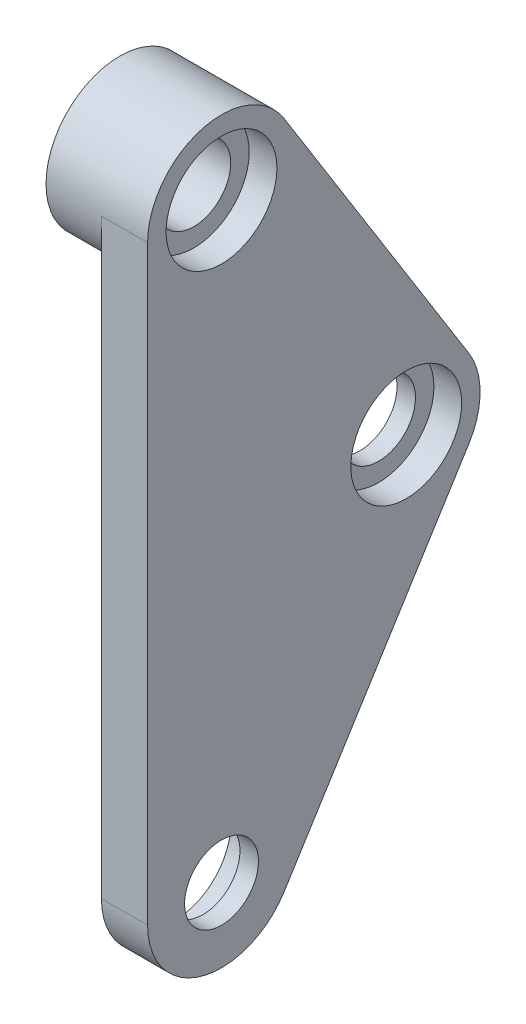
ISO-10303-21;
HEADER;
FILE_DESCRIPTION(('STEP AP214'),'2;1');
FILE_NAME('part.step','',(''),(''),'','','');
FILE_SCHEMA(('AUTOMOTIVE_DESIGN { 1 0 10303 214 1 1 1 1 }'));
ENDSEC;
DATA;
#1=APPLICATION_CONTEXT('core data for automotive mechanical design processes');
#2=APPLICATION_PROTOCOL_DEFINITION('international standard','automotive_design',2000,#1);
#3=PRODUCT_CONTEXT('',#1,'mechanical');
#4=PRODUCT('Part','Part','',(#3));
#5=PRODUCT_RELATED_PRODUCT_CATEGORY('part','',(#4));
#6=PRODUCT_DEFINITION_FORMATION('','',#4);
#7=PRODUCT_DEFINITION_CONTEXT('part definition',#1,'design');
#8=PRODUCT_DEFINITION('design','',#6,#7);
#9=PRODUCT_DEFINITION_SHAPE('','',#8);
#10=(LENGTH_UNIT() NAMED_UNIT(*) SI_UNIT(.MILLI.,.METRE.));
#11=(NAMED_UNIT(*) PLANE_ANGLE_UNIT() SI_UNIT($,.RADIAN.));
#12=(NAMED_UNIT(*) SI_UNIT($,.STERADIAN.) SOLID_ANGLE_UNIT());
#13=UNCERTAINTY_MEASURE_WITH_UNIT(LENGTH_MEASURE(1.E-05),#10,'distance_accuracy_value','');
#14=(GEOMETRIC_REPRESENTATION_CONTEXT(3) GLOBAL_UNCERTAINTY_ASSIGNED_CONTEXT((#13)) GLOBAL_UNIT_ASSIGNED_CONTEXT((#10,
#11,#12)) REPRESENTATION_CONTEXT('',''));
#15=CARTESIAN_POINT('',(0.,0.,0.));
#16=DIRECTION('',(0.,0.,1.));
#17=DIRECTION('',(1.,0.,0.));
#18=AXIS2_PLACEMENT_3D('',#15,#16,#17);
#19=CARTESIAN_POINT('',(2.5,-4.,-4.));
#20=DIRECTION('',(-1.,0.,0.));
#21=DIRECTION('',(0.,0.,1.));
#22=AXIS2_PLACEMENT_3D('',#19,#20,#21);
#23=CYLINDRICAL_SURFACE('',#22,2.);
#24=CARTESIAN_POINT('',(-3.,-4.,-4.));
#25=DIRECTION('',(1.,0.,0.));
#26=DIRECTION('',(0.,0.,-1.));
#27=AXIS2_PLACEMENT_3D('',#24,#25,#26);
#28=CIRCLE('',#27,2.);
#29=CARTESIAN_POINT('',(-3.,-4.,-6.));
#30=VERTEX_POINT('',#29);
#31=EDGE_CURVE('E240',#30,#30,#28,.T.);
#32=ORIENTED_EDGE('',*,*,#31,.F.);
#33=EDGE_LOOP('',(#32));
#34=FACE_BOUND('',#33,.T.);
#35=CARTESIAN_POINT('',(1.,-4.,-4.));
#36=DIRECTION('',(1.,0.,0.));
#37=DIRECTION('',(0.,0.,-1.));
#38=AXIS2_PLACEMENT_3D('',#35,#36,#37);
#39=CIRCLE('',#38,2.);
#40=CARTESIAN_POINT('',(1.,-4.,-6.));
#41=VERTEX_POINT('',#40);
#42=EDGE_CURVE('E243',#41,#41,#39,.F.);
#43=ORIENTED_EDGE('',*,*,#42,.F.);
#44=EDGE_LOOP('',(#43));
#45=FACE_BOUND('',#44,.T.);
#46=ADVANCED_FACE('F127',(#34,#45),#23,.F.);
#47=CARTESIAN_POINT('',(2.5,-20.,-14.));
#48=DIRECTION('',(-1.,0.,0.));
#49=DIRECTION('',(0.,0.,1.));
#50=AXIS2_PLACEMENT_3D('',#47,#48,#49);
#51=CYLINDRICAL_SURFACE('',#50,2.);
#52=CARTESIAN_POINT('',(0.,-20.,-14.));
#53=DIRECTION('',(1.,0.,0.));
#54=DIRECTION('',(0.,0.,-1.));
#55=AXIS2_PLACEMENT_3D('',#52,#53,#54);
#56=CIRCLE('',#55,2.);
#57=CARTESIAN_POINT('',(0.,-20.,-16.));
#58=VERTEX_POINT('',#57);
#59=EDGE_CURVE('E261',#58,#58,#56,.F.);
#60=ORIENTED_EDGE('',*,*,#59,.T.);
#61=EDGE_LOOP('',(#60));
#62=FACE_BOUND('',#61,.T.);
#63=CARTESIAN_POINT('',(1.,-20.,-14.));
#64=DIRECTION('',(1.,0.,0.));
#65=DIRECTION('',(0.,0.,-1.));
#66=AXIS2_PLACEMENT_3D('',#63,#64,#65);
#67=CIRCLE('',#66,2.);
#68=CARTESIAN_POINT('',(1.,-20.,-16.));
#69=VERTEX_POINT('',#68);
#70=EDGE_CURVE('E233',#69,#69,#67,.T.);
#71=ORIENTED_EDGE('',*,*,#70,.T.);
#72=EDGE_LOOP('',(#71));
#73=FACE_BOUND('',#72,.T.);
#74=ADVANCED_FACE('F287',(#62,#73),#51,.F.);
#75=CARTESIAN_POINT('',(2.5,2.79415306338351,-4.47064490141361));
#76=DIRECTION('',(0.,0.52999894000318,-0.847998304005088));
#77=DIRECTION('',(0.,0.847998304005088,0.52999894000318));
#78=AXIS2_PLACEMENT_3D('',#75,#76,#77);
#79=PLANE('',#78);
#80=DIRECTION('',(0.,-0.847998304005088,-0.52999894000318));
#81=VECTOR('',#80,1.);
#82=CARTESIAN_POINT('',(0.,2.79415306338351,-4.47064490141361));
#83=LINE('',#82,#81);
#84=CARTESIAN_POINT('',(0.,-1.88000423998728,-7.39199321602035));
#85=VERTEX_POINT('',#84);
#86=CARTESIAN_POINT('',(0.,-17.8800042399873,-17.3919932160204));
#87=VERTEX_POINT('',#86);
#88=EDGE_CURVE('E215',#85,#87,#83,.T.);
#89=ORIENTED_EDGE('',*,*,#88,.F.);
#90=DIRECTION('',(-1.,0.,0.));
#91=VECTOR('',#90,1.);
#92=CARTESIAN_POINT('',(2.5,-1.88000423998728,-7.39199321602035));
#93=LINE('',#92,#91);
#94=CARTESIAN_POINT('',(2.5,-1.88000423998728,-7.39199321602035));
#95=VERTEX_POINT('',#94);
#96=EDGE_CURVE('E224',#95,#85,#93,.T.);
#97=ORIENTED_EDGE('',*,*,#96,.F.);
#98=DIRECTION('',(0.,-0.847998304005088,-0.52999894000318));
#99=VECTOR('',#98,1.);
#100=CARTESIAN_POINT('',(2.5,2.79415306338351,-4.47064490141361));
#101=LINE('',#100,#99);
#102=CARTESIAN_POINT('',(2.5,-17.8800042399873,-17.3919932160204));
#103=VERTEX_POINT('',#102);
#104=EDGE_CURVE('E208',#95,#103,#101,.T.);
#105=ORIENTED_EDGE('',*,*,#104,.T.);
#106=DIRECTION('',(-1.,0.,0.));
#107=VECTOR('',#106,1.);
#108=CARTESIAN_POINT('',(2.5,-17.8800042399873,-17.3919932160204));
#109=LINE('',#108,#107);
#110=EDGE_CURVE('E137',#103,#87,#109,.T.);
#111=ORIENTED_EDGE('',*,*,#110,.T.);
#112=EDGE_LOOP('',(#89,#97,#105,#111));
#113=FACE_BOUND('',#112,.T.);
#114=ADVANCED_FACE('F293',(#113),#79,.T.);
#115=CARTESIAN_POINT('',(2.5,0.,0.));
#116=DIRECTION('',(0.,0.,-1.));
#117=DIRECTION('',(-1.,0.,0.));
#118=AXIS2_PLACEMENT_3D('',#115,#116,#117);
#119=PLANE('',#118);
#120=DIRECTION('',(0.,-1.,0.));
#121=VECTOR('',#120,1.);
#122=CARTESIAN_POINT('',(0.,0.,0.));
#123=LINE('',#122,#121);
#124=CARTESIAN_POINT('',(0.,-4.,0.));
#125=VERTEX_POINT('',#124);
#126=CARTESIAN_POINT('',(0.,-36.,0.));
#127=VERTEX_POINT('',#126);
#128=EDGE_CURVE('E190',#125,#127,#123,.T.);
#129=ORIENTED_EDGE('',*,*,#128,.T.);
#130=DIRECTION('',(-1.,0.,0.));
#131=VECTOR('',#130,1.);
#132=CARTESIAN_POINT('',(2.5,-36.,0.));
#133=LINE('',#132,#131);
#134=CARTESIAN_POINT('',(2.5,-36.,0.));
#135=VERTEX_POINT('',#134);
#136=EDGE_CURVE('E183',#135,#127,#133,.T.);
#137=ORIENTED_EDGE('',*,*,#136,.F.);
#138=DIRECTION('',(0.,-1.,0.));
#139=VECTOR('',#138,1.);
#140=CARTESIAN_POINT('',(2.5,0.,0.));
#141=LINE('',#140,#139);
#142=CARTESIAN_POINT('',(2.5,-4.,0.));
#143=VERTEX_POINT('',#142);
#144=EDGE_CURVE('E188',#143,#135,#141,.T.);
#145=ORIENTED_EDGE('',*,*,#144,.F.);
#146=DIRECTION('',(-1.,0.,0.));
#147=VECTOR('',#146,1.);
#148=CARTESIAN_POINT('',(2.5,-4.,0.));
#149=LINE('',#148,#147);
#150=EDGE_CURVE('E193',#143,#125,#149,.T.);
#151=ORIENTED_EDGE('',*,*,#150,.T.);
#152=EDGE_LOOP('',(#129,#137,#145,#151));
#153=FACE_BOUND('',#152,.T.);
#154=ADVANCED_FACE('F185',(#153),#119,.F.);
#155=CARTESIAN_POINT('',(2.5,-14.0301081195633,-22.4481729913013));
#156=DIRECTION('',(0.,-0.52999894000318,-0.847998304005088));
#157=DIRECTION('',(0.,0.847998304005088,-0.52999894000318));
#158=AXIS2_PLACEMENT_3D('',#155,#156,#157);
#159=PLANE('',#158);
#160=DIRECTION('',(0.,-0.847998304005088,0.52999894000318));
#161=VECTOR('',#160,1.);
#162=CARTESIAN_POINT('',(0.,-14.0301081195633,-22.4481729913013));
#163=LINE('',#162,#161);
#164=CARTESIAN_POINT('',(0.,-22.1199957600127,-17.3919932160204));
#165=VERTEX_POINT('',#164);
#166=CARTESIAN_POINT('',(0.,-38.1199957600127,-7.39199321602035));
#167=VERTEX_POINT('',#166);
#168=EDGE_CURVE('E212',#165,#167,#163,.T.);
#169=ORIENTED_EDGE('',*,*,#168,.F.);
#170=DIRECTION('',(-1.,0.,0.));
#171=VECTOR('',#170,1.);
#172=CARTESIAN_POINT('',(2.5,-22.1199957600127,-17.3919932160204));
#173=LINE('',#172,#171);
#174=CARTESIAN_POINT('',(2.5,-22.1199957600127,-17.3919932160204));
#175=VERTEX_POINT('',#174);
#176=EDGE_CURVE('E146',#175,#165,#173,.T.);
#177=ORIENTED_EDGE('',*,*,#176,.F.);
#178=DIRECTION('',(0.,-0.847998304005088,0.52999894000318));
#179=VECTOR('',#178,1.);
#180=CARTESIAN_POINT('',(2.5,-14.0301081195633,-22.4481729913013));
#181=LINE('',#180,#179);
#182=CARTESIAN_POINT('',(2.5,-38.1199957600127,-7.39199321602035));
#183=VERTEX_POINT('',#182);
#184=EDGE_CURVE('E207',#175,#183,#181,.T.);
#185=ORIENTED_EDGE('',*,*,#184,.T.);
#186=DIRECTION('',(-1.,0.,0.));
#187=VECTOR('',#186,1.);
#188=CARTESIAN_POINT('',(2.5,-38.1199957600127,-7.39199321602035));
#189=LINE('',#188,#187);
#190=EDGE_CURVE('E163',#183,#167,#189,.T.);
#191=ORIENTED_EDGE('',*,*,#190,.T.);
#192=EDGE_LOOP('',(#169,#177,#185,#191));
#193=FACE_BOUND('',#192,.T.);
#194=ADVANCED_FACE('F338',(#193),#159,.T.);
#195=CARTESIAN_POINT('',(0.,0.,0.));
#196=DIRECTION('',(1.,0.,0.));
#197=DIRECTION('',(0.,0.,-1.));
#198=AXIS2_PLACEMENT_3D('',#195,#196,#197);
#199=PLANE('',#198);
#200=CARTESIAN_POINT('',(0.,-36.,-4.));
#201=DIRECTION('',(1.,0.,0.));
#202=DIRECTION('',(0.,0.,-1.));
#203=AXIS2_PLACEMENT_3D('',#200,#201,#202);
#204=CIRCLE('',#203,3.);
#205=CARTESIAN_POINT('',(0.,-36.,-7.));
#206=VERTEX_POINT('',#205);
#207=EDGE_CURVE('E329',#206,#206,#204,.T.);
#208=ORIENTED_EDGE('',*,*,#207,.T.);
#209=EDGE_LOOP('',(#208));
#210=FACE_BOUND('',#209,.T.);
#211=ORIENTED_EDGE('',*,*,#59,.F.);
#212=EDGE_LOOP('',(#211));
#213=FACE_BOUND('',#212,.T.);
#214=ORIENTED_EDGE('',*,*,#128,.F.);
#215=CARTESIAN_POINT('',(0.,-4.,-4.));
#216=DIRECTION('',(1.,0.,0.));
#217=DIRECTION('',(0.,0.,-1.));
#218=AXIS2_PLACEMENT_3D('',#215,#216,#217);
#219=CIRCLE('',#218,4.);
#220=EDGE_CURVE('E13',#125,#85,#219,.T.);
#221=ORIENTED_EDGE('',*,*,#220,.T.);
#222=ORIENTED_EDGE('',*,*,#88,.T.);
#223=CARTESIAN_POINT('',(0.,-20.,-14.));
#224=DIRECTION('',(1.,0.,0.));
#225=DIRECTION('',(0.,0.,-1.));
#226=AXIS2_PLACEMENT_3D('',#223,#224,#225);
#227=CIRCLE('',#226,4.);
#228=EDGE_CURVE('E199',#165,#87,#227,.T.);
#229=ORIENTED_EDGE('',*,*,#228,.F.);
#230=ORIENTED_EDGE('',*,*,#168,.T.);
#231=CARTESIAN_POINT('',(0.,-36.,-4.));
#232=DIRECTION('',(1.,0.,0.));
#233=DIRECTION('',(0.,0.,-1.));
#234=AXIS2_PLACEMENT_3D('',#231,#232,#233);
#235=CIRCLE('',#234,4.);
#236=EDGE_CURVE('E200',#127,#167,#235,.T.);
#237=ORIENTED_EDGE('',*,*,#236,.F.);
#238=EDGE_LOOP('',(#214,#221,#222,#229,#230,#237));
#239=FACE_BOUND('',#238,.T.);
#240=ADVANCED_FACE('F334',(#210,#213,#239),#199,.F.);
#241=CARTESIAN_POINT('',(2.5,0.,0.));
#242=DIRECTION('',(1.,0.,0.));
#243=DIRECTION('',(0.,0.,-1.));
#244=AXIS2_PLACEMENT_3D('',#241,#242,#243);
#245=PLANE('',#244);
#246=CARTESIAN_POINT('',(2.5,-4.,-4.));
#247=DIRECTION('',(1.,0.,0.));
#248=DIRECTION('',(0.,0.,-1.));
#249=AXIS2_PLACEMENT_3D('',#246,#247,#248);
#250=CIRCLE('',#249,3.);
#251=CARTESIAN_POINT('',(2.5,-4.,-7.));
#252=VERTEX_POINT('',#251);
#253=EDGE_CURVE('E248',#252,#252,#250,.T.);
#254=ORIENTED_EDGE('',*,*,#253,.F.);
#255=EDGE_LOOP('',(#254));
#256=FACE_BOUND('',#255,.T.);
#257=CARTESIAN_POINT('',(2.5,-20.,-14.));
#258=DIRECTION('',(1.,0.,0.));
#259=DIRECTION('',(0.,0.,-1.));
#260=AXIS2_PLACEMENT_3D('',#257,#258,#259);
#261=CIRCLE('',#260,3.);
#262=CARTESIAN_POINT('',(2.5,-20.,-17.));
#263=VERTEX_POINT('',#262);
#264=EDGE_CURVE('E254',#263,#263,#261,.T.);
#265=ORIENTED_EDGE('',*,*,#264,.F.);
#266=EDGE_LOOP('',(#265));
#267=FACE_BOUND('',#266,.T.);
#268=CARTESIAN_POINT('',(2.5,-36.,-4.));
#269=DIRECTION('',(1.,0.,0.));
#270=DIRECTION('',(0.,0.,-1.));
#271=AXIS2_PLACEMENT_3D('',#268,#269,#270);
#272=CIRCLE('',#271,2.);
#273=CARTESIAN_POINT('',(2.5,-36.,-6.));
#274=VERTEX_POINT('',#273);
#275=EDGE_CURVE('E235',#274,#274,#272,.T.);
#276=ORIENTED_EDGE('',*,*,#275,.F.);
#277=EDGE_LOOP('',(#276));
#278=FACE_BOUND('',#277,.T.);
#279=ORIENTED_EDGE('',*,*,#184,.F.);
#280=CARTESIAN_POINT('',(2.5,-20.,-14.));
#281=DIRECTION('',(1.,0.,0.));
#282=DIRECTION('',(0.,0.,-1.));
#283=AXIS2_PLACEMENT_3D('',#280,#281,#282);
#284=CIRCLE('',#283,4.);
#285=EDGE_CURVE('E229',#175,#103,#284,.T.);
#286=ORIENTED_EDGE('',*,*,#285,.T.);
#287=ORIENTED_EDGE('',*,*,#104,.F.);
#288=CARTESIAN_POINT('',(2.5,-4.,-4.));
#289=DIRECTION('',(1.,0.,0.));
#290=DIRECTION('',(0.,0.,-1.));
#291=AXIS2_PLACEMENT_3D('',#288,#289,#290);
#292=CIRCLE('',#291,4.);
#293=EDGE_CURVE('E206',#95,#143,#292,.T.);
#294=ORIENTED_EDGE('',*,*,#293,.T.);
#295=ORIENTED_EDGE('',*,*,#144,.T.);
#296=CARTESIAN_POINT('',(2.5,-36.,-4.));
#297=DIRECTION('',(1.,0.,0.));
#298=DIRECTION('',(0.,0.,-1.));
#299=AXIS2_PLACEMENT_3D('',#296,#297,#298);
#300=CIRCLE('',#299,4.);
#301=EDGE_CURVE('E196',#135,#183,#300,.T.);
#302=ORIENTED_EDGE('',*,*,#301,.T.);
#303=EDGE_LOOP('',(#279,#286,#287,#294,#295,#302));
#304=FACE_BOUND('',#303,.T.);
#305=ADVANCED_FACE('F203',(#256,#267,#278,#304),#245,.T.);
#306=CARTESIAN_POINT('',(2.5,-36.,-4.));
#307=DIRECTION('',(-1.,0.,0.));
#308=DIRECTION('',(0.,0.,1.));
#309=AXIS2_PLACEMENT_3D('',#306,#307,#308);
#310=CYLINDRICAL_SURFACE('',#309,4.);
#311=ORIENTED_EDGE('',*,*,#301,.F.);
#312=ORIENTED_EDGE('',*,*,#136,.T.);
#313=ORIENTED_EDGE('',*,*,#236,.T.);
#314=ORIENTED_EDGE('',*,*,#190,.F.);
#315=EDGE_LOOP('',(#311,#312,#313,#314));
#316=FACE_BOUND('',#315,.T.);
#317=ADVANCED_FACE('F129',(#316),#310,.T.);
#318=CARTESIAN_POINT('',(2.5,-20.,-14.));
#319=DIRECTION('',(-1.,0.,0.));
#320=DIRECTION('',(0.,0.,1.));
#321=AXIS2_PLACEMENT_3D('',#318,#319,#320);
#322=CYLINDRICAL_SURFACE('',#321,4.);
#323=ORIENTED_EDGE('',*,*,#228,.T.);
#324=ORIENTED_EDGE('',*,*,#110,.F.);
#325=ORIENTED_EDGE('',*,*,#285,.F.);
#326=ORIENTED_EDGE('',*,*,#176,.T.);
#327=EDGE_LOOP('',(#323,#324,#325,#326));
#328=FACE_BOUND('',#327,.T.);
#329=ADVANCED_FACE('F282',(#328),#322,.T.);
#330=CARTESIAN_POINT('',(2.5,-4.,-4.));
#331=DIRECTION('',(-1.,0.,0.));
#332=DIRECTION('',(0.,0.,1.));
#333=AXIS2_PLACEMENT_3D('',#330,#331,#332);
#334=CYLINDRICAL_SURFACE('',#333,4.);
#335=ORIENTED_EDGE('',*,*,#293,.F.);
#336=ORIENTED_EDGE('',*,*,#96,.T.);
#337=ORIENTED_EDGE('',*,*,#220,.F.);
#338=ORIENTED_EDGE('',*,*,#150,.F.);
#339=EDGE_LOOP('',(#335,#336,#337,#338));
#340=FACE_BOUND('',#339,.T.);
#341=CARTESIAN_POINT('',(-3.,-4.,-4.));
#342=DIRECTION('',(1.,0.,0.));
#343=DIRECTION('',(0.,0.,-1.));
#344=AXIS2_PLACEMENT_3D('',#341,#342,#343);
#345=CIRCLE('',#344,4.);
#346=CARTESIAN_POINT('',(-3.,-4.,-8.));
#347=VERTEX_POINT('',#346);
#348=EDGE_CURVE('E232',#347,#347,#345,.T.);
#349=ORIENTED_EDGE('',*,*,#348,.T.);
#350=EDGE_LOOP('',(#349));
#351=FACE_BOUND('',#350,.T.);
#352=ADVANCED_FACE('F268',(#340,#351),#334,.T.);
#353=CARTESIAN_POINT('',(-3.,-4.,-4.));
#354=DIRECTION('',(1.,0.,0.));
#355=DIRECTION('',(0.,0.,-1.));
#356=AXIS2_PLACEMENT_3D('',#353,#354,#355);
#357=PLANE('',#356);
#358=ORIENTED_EDGE('',*,*,#31,.T.);
#359=EDGE_LOOP('',(#358));
#360=FACE_BOUND('',#359,.T.);
#361=ORIENTED_EDGE('',*,*,#348,.F.);
#362=EDGE_LOOP('',(#361));
#363=FACE_BOUND('',#362,.T.);
#364=ADVANCED_FACE('F270',(#360,#363),#357,.F.);
#365=CARTESIAN_POINT('',(2.5,-36.,-4.));
#366=DIRECTION('',(-1.,0.,0.));
#367=DIRECTION('',(0.,0.,1.));
#368=AXIS2_PLACEMENT_3D('',#365,#366,#367);
#369=CYLINDRICAL_SURFACE('',#368,2.);
#370=CARTESIAN_POINT('',(1.5,-36.,-4.));
#371=DIRECTION('',(1.,0.,0.));
#372=DIRECTION('',(0.,0.,-1.));
#373=AXIS2_PLACEMENT_3D('',#370,#371,#372);
#374=CIRCLE('',#373,2.);
#375=CARTESIAN_POINT('',(1.5,-36.,-6.));
#376=VERTEX_POINT('',#375);
#377=EDGE_CURVE('E131',#376,#376,#374,.T.);
#378=ORIENTED_EDGE('',*,*,#377,.F.);
#379=EDGE_LOOP('',(#378));
#380=FACE_BOUND('',#379,.T.);
#381=ORIENTED_EDGE('',*,*,#275,.T.);
#382=EDGE_LOOP('',(#381));
#383=FACE_BOUND('',#382,.T.);
#384=ADVANCED_FACE('F272',(#380,#383),#369,.F.);
#385=CARTESIAN_POINT('',(1.,-20.,-14.));
#386=DIRECTION('',(1.,0.,0.));
#387=DIRECTION('',(0.,0.,-1.));
#388=AXIS2_PLACEMENT_3D('',#385,#386,#387);
#389=CYLINDRICAL_SURFACE('',#388,3.);
#390=CARTESIAN_POINT('',(1.,-20.,-14.));
#391=DIRECTION('',(1.,0.,0.));
#392=DIRECTION('',(0.,0.,-1.));
#393=AXIS2_PLACEMENT_3D('',#390,#391,#392);
#394=CIRCLE('',#393,3.);
#395=CARTESIAN_POINT('',(1.,-20.,-17.));
#396=VERTEX_POINT('',#395);
#397=EDGE_CURVE('E257',#396,#396,#394,.T.);
#398=ORIENTED_EDGE('',*,*,#397,.F.);
#399=EDGE_LOOP('',(#398));
#400=FACE_BOUND('',#399,.T.);
#401=ORIENTED_EDGE('',*,*,#264,.T.);
#402=EDGE_LOOP('',(#401));
#403=FACE_BOUND('',#402,.T.);
#404=ADVANCED_FACE('F279',(#400,#403),#389,.F.);
#405=CARTESIAN_POINT('',(1.,-20.,-14.));
#406=DIRECTION('',(1.,0.,0.));
#407=DIRECTION('',(0.,0.,-1.));
#408=AXIS2_PLACEMENT_3D('',#405,#406,#407);
#409=PLANE('',#408);
#410=ORIENTED_EDGE('',*,*,#70,.F.);
#411=EDGE_LOOP('',(#410));
#412=FACE_BOUND('',#411,.T.);
#413=ORIENTED_EDGE('',*,*,#397,.T.);
#414=EDGE_LOOP('',(#413));
#415=FACE_BOUND('',#414,.T.);
#416=ADVANCED_FACE('F299',(#412,#415),#409,.T.);
#417=CARTESIAN_POINT('',(1.,-4.,-4.));
#418=DIRECTION('',(1.,0.,0.));
#419=DIRECTION('',(0.,0.,-1.));
#420=AXIS2_PLACEMENT_3D('',#417,#418,#419);
#421=CYLINDRICAL_SURFACE('',#420,3.);
#422=CARTESIAN_POINT('',(1.,-4.,-4.));
#423=DIRECTION('',(1.,0.,0.));
#424=DIRECTION('',(0.,0.,-1.));
#425=AXIS2_PLACEMENT_3D('',#422,#423,#424);
#426=CIRCLE('',#425,3.);
#427=CARTESIAN_POINT('',(1.,-4.,-7.));
#428=VERTEX_POINT('',#427);
#429=EDGE_CURVE('E236',#428,#428,#426,.T.);
#430=ORIENTED_EDGE('',*,*,#429,.F.);
#431=EDGE_LOOP('',(#430));
#432=FACE_BOUND('',#431,.T.);
#433=ORIENTED_EDGE('',*,*,#253,.T.);
#434=EDGE_LOOP('',(#433));
#435=FACE_BOUND('',#434,.T.);
#436=ADVANCED_FACE('F302',(#432,#435),#421,.F.);
#437=CARTESIAN_POINT('',(1.,0.,0.));
#438=DIRECTION('',(1.,0.,0.));
#439=DIRECTION('',(0.,0.,-1.));
#440=AXIS2_PLACEMENT_3D('',#437,#438,#439);
#441=PLANE('',#440);
#442=ORIENTED_EDGE('',*,*,#42,.T.);
#443=EDGE_LOOP('',(#442));
#444=FACE_BOUND('',#443,.T.);
#445=ORIENTED_EDGE('',*,*,#429,.T.);
#446=EDGE_LOOP('',(#445));
#447=FACE_BOUND('',#446,.T.);
#448=ADVANCED_FACE('F309',(#444,#447),#441,.T.);
#449=CARTESIAN_POINT('',(1.5,-36.,-4.));
#450=DIRECTION('',(-1.,0.,0.));
#451=DIRECTION('',(0.,0.,1.));
#452=AXIS2_PLACEMENT_3D('',#449,#450,#451);
#453=CYLINDRICAL_SURFACE('',#452,3.);
#454=CARTESIAN_POINT('',(1.5,-36.,-4.));
#455=DIRECTION('',(1.,0.,0.));
#456=DIRECTION('',(0.,0.,-1.));
#457=AXIS2_PLACEMENT_3D('',#454,#455,#456);
#458=CIRCLE('',#457,3.);
#459=CARTESIAN_POINT('',(1.5,-36.,-7.));
#460=VERTEX_POINT('',#459);
#461=EDGE_CURVE('E328',#460,#460,#458,.T.);
#462=ORIENTED_EDGE('',*,*,#461,.T.);
#463=EDGE_LOOP('',(#462));
#464=FACE_BOUND('',#463,.T.);
#465=ORIENTED_EDGE('',*,*,#207,.F.);
#466=EDGE_LOOP('',(#465));
#467=FACE_BOUND('',#466,.T.);
#468=ADVANCED_FACE('F313',(#464,#467),#453,.F.);
#469=CARTESIAN_POINT('',(1.5,-36.,-4.));
#470=DIRECTION('',(1.,0.,0.));
#471=DIRECTION('',(0.,0.,-1.));
#472=AXIS2_PLACEMENT_3D('',#469,#470,#471);
#473=PLANE('',#472);
#474=ORIENTED_EDGE('',*,*,#377,.T.);
#475=EDGE_LOOP('',(#474));
#476=FACE_BOUND('',#475,.T.);
#477=ORIENTED_EDGE('',*,*,#461,.F.);
#478=EDGE_LOOP('',(#477));
#479=FACE_BOUND('',#478,.T.);
#480=ADVANCED_FACE('F317',(#476,#479),#473,.F.);
#481=CLOSED_SHELL('',(#46,#74,#114,#154,#194,#240,#305,#317,#329,#352,#364,#384,#404,#416,#436,
#448,#468,#480));
#482=MANIFOLD_SOLID_BREP('B2',#481);
#483=ADVANCED_BREP_SHAPE_REPRESENTATION('',(#18,#482),#14);
#484=SHAPE_DEFINITION_REPRESENTATION(#9,#483);
ENDSEC;
END-ISO-10303-21;
